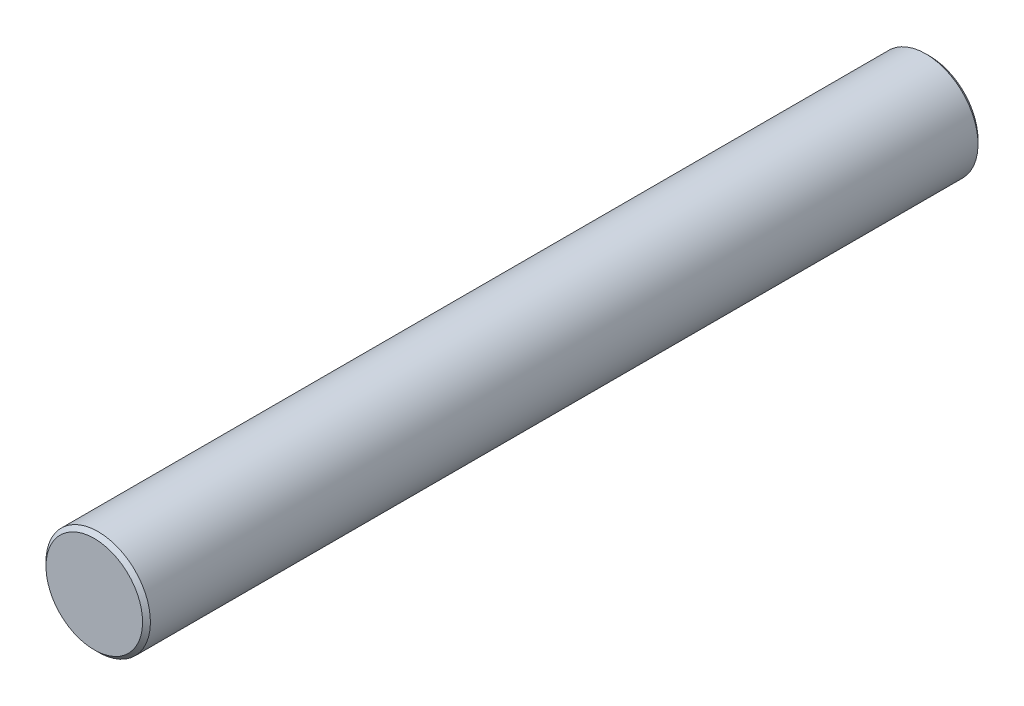
ISO-10303-21;
HEADER;
FILE_DESCRIPTION(('STEP AP214'),'2;1');
FILE_NAME('part.step','',(''),(''),'','','');
FILE_SCHEMA(('AUTOMOTIVE_DESIGN { 1 0 10303 214 1 1 1 1 }'));
ENDSEC;
DATA;
#1=APPLICATION_CONTEXT('core data for automotive mechanical design processes');
#2=APPLICATION_PROTOCOL_DEFINITION('international standard','automotive_design',2000,#1);
#3=PRODUCT_CONTEXT('',#1,'mechanical');
#4=PRODUCT('Part','Part','',(#3));
#5=PRODUCT_RELATED_PRODUCT_CATEGORY('part','',(#4));
#6=PRODUCT_DEFINITION_FORMATION('','',#4);
#7=PRODUCT_DEFINITION_CONTEXT('part definition',#1,'design');
#8=PRODUCT_DEFINITION('design','',#6,#7);
#9=PRODUCT_DEFINITION_SHAPE('','',#8);
#10=(LENGTH_UNIT() NAMED_UNIT(*) SI_UNIT(.MILLI.,.METRE.));
#11=(NAMED_UNIT(*) PLANE_ANGLE_UNIT() SI_UNIT($,.RADIAN.));
#12=(NAMED_UNIT(*) SI_UNIT($,.STERADIAN.) SOLID_ANGLE_UNIT());
#13=UNCERTAINTY_MEASURE_WITH_UNIT(LENGTH_MEASURE(1.E-05),#10,'distance_accuracy_value','');
#14=(GEOMETRIC_REPRESENTATION_CONTEXT(3) GLOBAL_UNCERTAINTY_ASSIGNED_CONTEXT((#13)) GLOBAL_UNIT_ASSIGNED_CONTEXT((#10,
#11,#12)) REPRESENTATION_CONTEXT('',''));
#15=CARTESIAN_POINT('',(0.,0.,0.));
#16=DIRECTION('',(0.,0.,1.));
#17=DIRECTION('',(1.,0.,0.));
#18=AXIS2_PLACEMENT_3D('',#15,#16,#17);
#19=CARTESIAN_POINT('',(0.,9.25,0.));
#20=DIRECTION('',(0.,0.,-1.));
#21=DIRECTION('',(0.,1.,0.));
#22=AXIS2_PLACEMENT_3D('',#19,#20,#21);
#23=PLANE('',#22);
#24=CARTESIAN_POINT('',(0.,0.,0.));
#25=DIRECTION('',(0.,0.,-1.));
#26=DIRECTION('',(0.,1.,0.));
#27=AXIS2_PLACEMENT_3D('',#24,#25,#26);
#28=CIRCLE('',#27,18.5);
#29=CARTESIAN_POINT('',(0.,18.5,0.));
#30=VERTEX_POINT('',#29);
#31=EDGE_CURVE('E9',#30,#30,#28,.T.);
#32=ORIENTED_EDGE('',*,*,#31,.T.);
#33=EDGE_LOOP('',(#32));
#34=FACE_BOUND('',#33,.T.);
#35=CARTESIAN_POINT('',(0.,0.,0.));
#36=DIRECTION('',(0.,0.,1.));
#37=DIRECTION('',(-1.,0.,0.));
#38=AXIS2_PLACEMENT_3D('',#35,#36,#37);
#39=CIRCLE('',#38,6.);
#40=CARTESIAN_POINT('',(-6.,0.,0.));
#41=VERTEX_POINT('',#40);
#42=EDGE_CURVE('E52',#41,#41,#39,.T.);
#43=ORIENTED_EDGE('',*,*,#42,.T.);
#44=EDGE_LOOP('',(#43));
#45=FACE_BOUND('',#44,.T.);
#46=ADVANCED_FACE('F15',(#34,#45),#23,.T.);
#47=CARTESIAN_POINT('',(0.,0.,0.75));
#48=DIRECTION('',(0.,0.,1.));
#49=DIRECTION('',(0.,1.,0.));
#50=AXIS2_PLACEMENT_3D('',#47,#48,#49);
#51=CONICAL_SURFACE('',#50,19.25,0.785398163397448);
#52=CARTESIAN_POINT('',(0.,0.,1.5));
#53=DIRECTION('',(0.,0.,-1.));
#54=DIRECTION('',(0.,1.,0.));
#55=AXIS2_PLACEMENT_3D('',#52,#53,#54);
#56=CIRCLE('',#55,20.);
#57=CARTESIAN_POINT('',(0.,20.,1.5));
#58=VERTEX_POINT('',#57);
#59=EDGE_CURVE('E25',#58,#58,#56,.T.);
#60=ORIENTED_EDGE('',*,*,#59,.T.);
#61=EDGE_LOOP('',(#60));
#62=FACE_BOUND('',#61,.T.);
#63=ORIENTED_EDGE('',*,*,#31,.F.);
#64=EDGE_LOOP('',(#63));
#65=FACE_BOUND('',#64,.T.);
#66=ADVANCED_FACE('F121',(#62,#65),#51,.T.);
#67=CARTESIAN_POINT('',(0.,0.,160.));
#68=DIRECTION('',(0.,0.,1.));
#69=DIRECTION('',(0.,1.,0.));
#70=AXIS2_PLACEMENT_3D('',#67,#68,#69);
#71=CYLINDRICAL_SURFACE('',#70,20.);
#72=CARTESIAN_POINT('',(0.,0.,318.5));
#73=DIRECTION('',(0.,0.,-1.));
#74=DIRECTION('',(0.,1.,0.));
#75=AXIS2_PLACEMENT_3D('',#72,#73,#74);
#76=CIRCLE('',#75,20.);
#77=CARTESIAN_POINT('',(0.,20.,318.5));
#78=VERTEX_POINT('',#77);
#79=EDGE_CURVE('E19',#78,#78,#76,.T.);
#80=ORIENTED_EDGE('',*,*,#79,.T.);
#81=EDGE_LOOP('',(#80));
#82=FACE_BOUND('',#81,.T.);
#83=ORIENTED_EDGE('',*,*,#59,.F.);
#84=EDGE_LOOP('',(#83));
#85=FACE_BOUND('',#84,.T.);
#86=CARTESIAN_POINT('',(0.,0.,6.5));
#87=DIRECTION('',(0.,0.,-1.));
#88=DIRECTION('',(0.,1.,0.));
#89=AXIS2_PLACEMENT_3D('',#86,#87,#88);
#90=CIRCLE('',#89,20.);
#91=CARTESIAN_POINT('',(10.5356537528527,-17.,6.5));
#92=VERTEX_POINT('',#91);
#93=CARTESIAN_POINT('',(-10.5356537528527,-17.,6.5));
#94=VERTEX_POINT('',#93);
#95=EDGE_CURVE('E69',#92,#94,#90,.T.);
#96=ORIENTED_EDGE('',*,*,#95,.T.);
#97=DIRECTION('',(0.,0.,1.));
#98=VECTOR('',#97,1.);
#99=CARTESIAN_POINT('',(-10.5356537528527,-17.,8.25));
#100=LINE('',#99,#98);
#101=CARTESIAN_POINT('',(-10.5356537528527,-17.,10.));
#102=VERTEX_POINT('',#101);
#103=EDGE_CURVE('E62',#94,#102,#100,.T.);
#104=ORIENTED_EDGE('',*,*,#103,.T.);
#105=CARTESIAN_POINT('',(0.,0.,10.));
#106=DIRECTION('',(0.,0.,1.));
#107=DIRECTION('',(0.,1.,0.));
#108=AXIS2_PLACEMENT_3D('',#105,#106,#107);
#109=CIRCLE('',#108,20.);
#110=CARTESIAN_POINT('',(10.5356537528527,-17.,10.));
#111=VERTEX_POINT('',#110);
#112=EDGE_CURVE('E75',#102,#111,#109,.T.);
#113=ORIENTED_EDGE('',*,*,#112,.T.);
#114=DIRECTION('',(0.,0.,-1.));
#115=VECTOR('',#114,1.);
#116=CARTESIAN_POINT('',(10.5356537528527,-17.,8.25));
#117=LINE('',#116,#115);
#118=EDGE_CURVE('E60',#111,#92,#117,.T.);
#119=ORIENTED_EDGE('',*,*,#118,.T.);
#120=EDGE_LOOP('',(#96,#104,#113,#119));
#121=FACE_BOUND('',#120,.T.);
#122=ADVANCED_FACE('F17',(#82,#85,#121),#71,.T.);
#123=CARTESIAN_POINT('',(0.,0.,319.25));
#124=DIRECTION('',(0.,0.,-1.));
#125=DIRECTION('',(0.,1.,0.));
#126=AXIS2_PLACEMENT_3D('',#123,#124,#125);
#127=CONICAL_SURFACE('',#126,19.25,0.785398163397448);
#128=CARTESIAN_POINT('',(0.,0.,320.));
#129=DIRECTION('',(0.,0.,-1.));
#130=DIRECTION('',(0.,1.,0.));
#131=AXIS2_PLACEMENT_3D('',#128,#129,#130);
#132=CIRCLE('',#131,18.5);
#133=CARTESIAN_POINT('',(0.,18.5,320.));
#134=VERTEX_POINT('',#133);
#135=EDGE_CURVE('E44',#134,#134,#132,.T.);
#136=ORIENTED_EDGE('',*,*,#135,.T.);
#137=EDGE_LOOP('',(#136));
#138=FACE_BOUND('',#137,.T.);
#139=ORIENTED_EDGE('',*,*,#79,.F.);
#140=EDGE_LOOP('',(#139));
#141=FACE_BOUND('',#140,.T.);
#142=ADVANCED_FACE('F116',(#138,#141),#127,.T.);
#143=CARTESIAN_POINT('',(0.,9.25,320.));
#144=DIRECTION('',(0.,0.,1.));
#145=DIRECTION('',(0.,-1.,0.));
#146=AXIS2_PLACEMENT_3D('',#143,#144,#145);
#147=PLANE('',#146);
#148=ORIENTED_EDGE('',*,*,#135,.F.);
#149=EDGE_LOOP('',(#148));
#150=FACE_BOUND('',#149,.T.);
#151=ADVANCED_FACE('F110',(#150),#147,.T.);
#152=CARTESIAN_POINT('',(0.,0.,26.4586213285198));
#153=DIRECTION('',(0.,0.,-1.));
#154=DIRECTION('',(-1.,0.,0.));
#155=AXIS2_PLACEMENT_3D('',#152,#153,#154);
#156=CONICAL_SURFACE('',#155,2.52640625,1.0471975511966);
#157=CARTESIAN_POINT('',(0.,0.,25.));
#158=DIRECTION('',(0.,0.,1.));
#159=DIRECTION('',(-1.,0.,0.));
#160=AXIS2_PLACEMENT_3D('',#157,#158,#159);
#161=CIRCLE('',#160,5.0528125);
#162=CARTESIAN_POINT('',(-5.0528125,0.,25.));
#163=VERTEX_POINT('',#162);
#164=EDGE_CURVE('E51',#163,#163,#161,.T.);
#165=ORIENTED_EDGE('',*,*,#164,.F.);
#166=EDGE_LOOP('',(#165));
#167=FACE_BOUND('',#166,.T.);
#168=CARTESIAN_POINT('',(0.,0.,27.9172426570397));
#169=VERTEX_POINT('',#168);
#170=VERTEX_LOOP('',#169);
#171=FACE_BOUND('',#170,.T.);
#172=ADVANCED_FACE('F104',(#167,#171),#156,.F.);
#173=CARTESIAN_POINT('',(0.,0.,12.97359375));
#174=DIRECTION('',(0.,0.,-1.));
#175=DIRECTION('',(-1.,0.,0.));
#176=AXIS2_PLACEMENT_3D('',#173,#174,#175);
#177=CYLINDRICAL_SURFACE('',#176,5.0528125);
#178=CARTESIAN_POINT('',(0.,0.,0.9471875));
#179=DIRECTION('',(0.,0.,1.));
#180=DIRECTION('',(-1.,0.,0.));
#181=AXIS2_PLACEMENT_3D('',#178,#179,#180);
#182=CIRCLE('',#181,5.0528125);
#183=CARTESIAN_POINT('',(-5.0528125,0.,0.9471875));
#184=VERTEX_POINT('',#183);
#185=EDGE_CURVE('E57',#184,#184,#182,.T.);
#186=ORIENTED_EDGE('',*,*,#185,.F.);
#187=EDGE_LOOP('',(#186));
#188=FACE_BOUND('',#187,.T.);
#189=ORIENTED_EDGE('',*,*,#164,.T.);
#190=EDGE_LOOP('',(#189));
#191=FACE_BOUND('',#190,.T.);
#192=ADVANCED_FACE('F101',(#188,#191),#177,.F.);
#193=CARTESIAN_POINT('',(0.,0.,0.47359375));
#194=DIRECTION('',(0.,0.,-1.));
#195=DIRECTION('',(-1.,0.,0.));
#196=AXIS2_PLACEMENT_3D('',#193,#194,#195);
#197=CONICAL_SURFACE('',#196,5.52640625,0.785398163397448);
#198=ORIENTED_EDGE('',*,*,#42,.F.);
#199=EDGE_LOOP('',(#198));
#200=FACE_BOUND('',#199,.T.);
#201=ORIENTED_EDGE('',*,*,#185,.T.);
#202=EDGE_LOOP('',(#201));
#203=FACE_BOUND('',#202,.T.);
#204=ADVANCED_FACE('F99',(#200,#203),#197,.F.);
#205=CARTESIAN_POINT('',(0.,-17.,8.25));
#206=DIRECTION('',(0.,-1.,0.));
#207=DIRECTION('',(0.,0.,-1.));
#208=AXIS2_PLACEMENT_3D('',#205,#206,#207);
#209=PLANE('',#208);
#210=ORIENTED_EDGE('',*,*,#103,.F.);
#211=DIRECTION('',(1.,0.,0.));
#212=VECTOR('',#211,1.);
#213=CARTESIAN_POINT('',(0.,-17.,6.5));
#214=LINE('',#213,#212);
#215=EDGE_CURVE('E66',#94,#92,#214,.T.);
#216=ORIENTED_EDGE('',*,*,#215,.T.);
#217=ORIENTED_EDGE('',*,*,#118,.F.);
#218=DIRECTION('',(-1.,0.,0.));
#219=VECTOR('',#218,1.);
#220=CARTESIAN_POINT('',(0.,-17.,10.));
#221=LINE('',#220,#219);
#222=EDGE_CURVE('E72',#111,#102,#221,.T.);
#223=ORIENTED_EDGE('',*,*,#222,.T.);
#224=EDGE_LOOP('',(#210,#216,#217,#223));
#225=FACE_BOUND('',#224,.T.);
#226=ADVANCED_FACE('F131',(#225),#209,.T.);
#227=CARTESIAN_POINT('',(0.,-19.5,6.5));
#228=DIRECTION('',(0.,0.,1.));
#229=DIRECTION('',(1.,0.,0.));
#230=AXIS2_PLACEMENT_3D('',#227,#228,#229);
#231=PLANE('',#230);
#232=ORIENTED_EDGE('',*,*,#95,.F.);
#233=ORIENTED_EDGE('',*,*,#215,.F.);
#234=EDGE_LOOP('',(#232,#233));
#235=FACE_BOUND('',#234,.T.);
#236=ADVANCED_FACE('F135',(#235),#231,.T.);
#237=CARTESIAN_POINT('',(0.,-19.5,10.));
#238=DIRECTION('',(0.,0.,1.));
#239=DIRECTION('',(1.,0.,0.));
#240=AXIS2_PLACEMENT_3D('',#237,#238,#239);
#241=PLANE('',#240);
#242=ORIENTED_EDGE('',*,*,#112,.F.);
#243=ORIENTED_EDGE('',*,*,#222,.F.);
#244=EDGE_LOOP('',(#242,#243));
#245=FACE_BOUND('',#244,.T.);
#246=ADVANCED_FACE('F87',(#245),#241,.F.);
#247=CLOSED_SHELL('',(#46,#66,#122,#142,#151,#172,#192,#204,#226,#236,#246));
#248=MANIFOLD_SOLID_BREP('B1',#247);
#249=ADVANCED_BREP_SHAPE_REPRESENTATION('',(#18,#248),#14);
#250=SHAPE_DEFINITION_REPRESENTATION(#9,#249);
ENDSEC;
END-ISO-10303-21;
